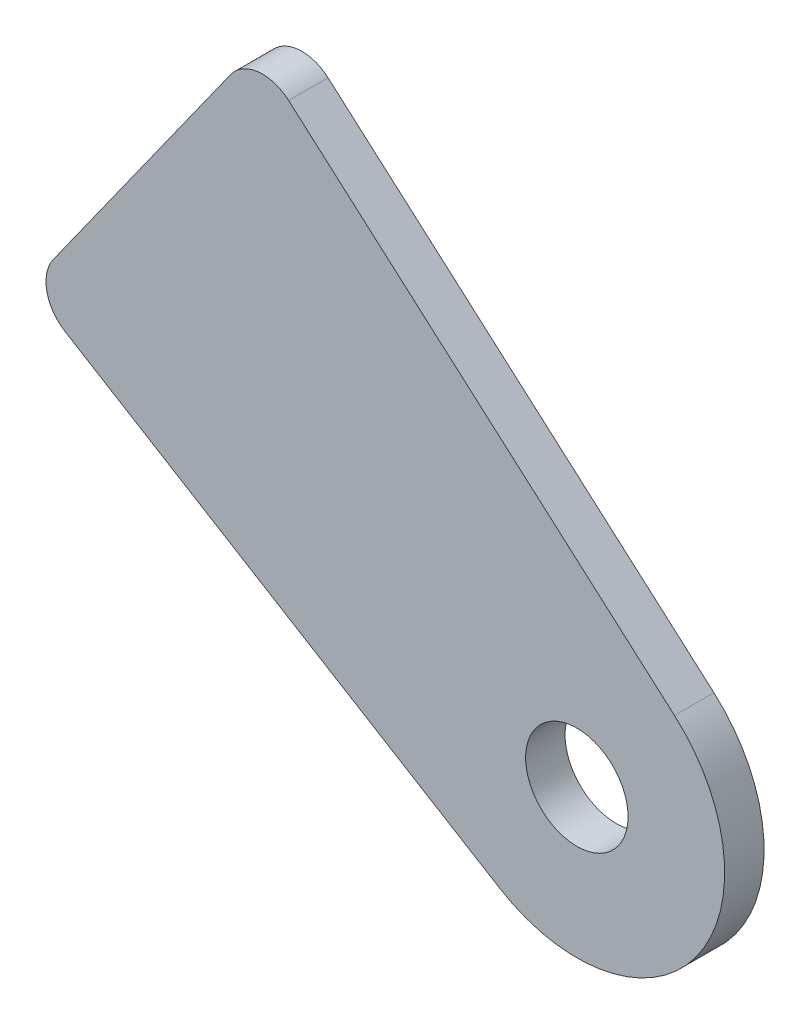
ISO-10303-21;
HEADER;
FILE_DESCRIPTION(('STEP AP214'),'2;1');
FILE_NAME('part.step','',(''),(''),'','','');
FILE_SCHEMA(('AUTOMOTIVE_DESIGN { 1 0 10303 214 1 1 1 1 }'));
ENDSEC;
DATA;
#1=APPLICATION_CONTEXT('core data for automotive mechanical design processes');
#2=APPLICATION_PROTOCOL_DEFINITION('international standard','automotive_design',2000,#1);
#3=PRODUCT_CONTEXT('',#1,'mechanical');
#4=PRODUCT('Part','Part','',(#3));
#5=PRODUCT_RELATED_PRODUCT_CATEGORY('part','',(#4));
#6=PRODUCT_DEFINITION_FORMATION('','',#4);
#7=PRODUCT_DEFINITION_CONTEXT('part definition',#1,'design');
#8=PRODUCT_DEFINITION('design','',#6,#7);
#9=PRODUCT_DEFINITION_SHAPE('','',#8);
#10=(LENGTH_UNIT() NAMED_UNIT(*) SI_UNIT(.MILLI.,.METRE.));
#11=(NAMED_UNIT(*) PLANE_ANGLE_UNIT() SI_UNIT($,.RADIAN.));
#12=(NAMED_UNIT(*) SI_UNIT($,.STERADIAN.) SOLID_ANGLE_UNIT());
#13=UNCERTAINTY_MEASURE_WITH_UNIT(LENGTH_MEASURE(1.E-05),#10,'distance_accuracy_value','');
#14=(GEOMETRIC_REPRESENTATION_CONTEXT(3) GLOBAL_UNCERTAINTY_ASSIGNED_CONTEXT((#13)) GLOBAL_UNIT_ASSIGNED_CONTEXT((#10,
#11,#12)) REPRESENTATION_CONTEXT('',''));
#15=CARTESIAN_POINT('',(0.,0.,0.));
#16=DIRECTION('',(0.,0.,1.));
#17=DIRECTION('',(1.,0.,0.));
#18=AXIS2_PLACEMENT_3D('',#15,#16,#17);
#19=CARTESIAN_POINT('',(29.2637866654175,-21.5291128535,2.54));
#20=DIRECTION('',(0.,0.,-1.));
#21=DIRECTION('',(-1.,0.,0.));
#22=AXIS2_PLACEMENT_3D('',#19,#20,#21);
#23=PLANE('',#22);
#24=DIRECTION('',(-0.750672826400325,0.660674131250912,0.));
#25=VECTOR('',#24,1.);
#26=CARTESIAN_POINT('',(35.5567077655825,-14.3789541820369,2.54));
#27=LINE('',#26,#25);
#28=CARTESIAN_POINT('',(35.5567077655825,-14.3789541820369,2.54));
#29=VERTEX_POINT('',#28);
#30=CARTESIAN_POINT('',(10.690577545839,7.50595812960176,2.54));
#31=VERTEX_POINT('',#30);
#32=EDGE_CURVE('E90',#29,#31,#27,.T.);
#33=ORIENTED_EDGE('',*,*,#32,.T.);
#34=CARTESIAN_POINT('',(9.01246525246168,5.59924915054494,2.54));
#35=DIRECTION('',(0.,0.,-1.));
#36=DIRECTION('',(-1.,0.,0.));
#37=AXIS2_PLACEMENT_3D('',#34,#35,#36);
#38=CIRCLE('',#37,2.54);
#39=CARTESIAN_POINT('',(6.94414597461786,7.07358132644683,2.54));
#40=VERTEX_POINT('',#39);
#41=EDGE_CURVE('E11',#31,#40,#38,.F.);
#42=ORIENTED_EDGE('',*,*,#41,.T.);
#43=DIRECTION('',(-0.580445738544051,-0.814298928284971,0.));
#44=VECTOR('',#43,1.);
#45=CARTESIAN_POINT('',(-6.05546921231891,-11.1633907312544,2.54));
#46=LINE('',#45,#44);
#47=CARTESIAN_POINT('',(-4.4708788368058,-8.94039182047327,2.54));
#48=VERTEX_POINT('',#47);
#49=EDGE_CURVE('E99',#40,#48,#46,.T.);
#50=ORIENTED_EDGE('',*,*,#49,.T.);
#51=CARTESIAN_POINT('',(-2.40255955896198,-10.4147239963752,2.54));
#52=DIRECTION('',(0.,0.,-1.));
#53=DIRECTION('',(-1.,0.,0.));
#54=AXIS2_PLACEMENT_3D('',#51,#52,#53);
#55=CIRCLE('',#54,2.54);
#56=CARTESIAN_POINT('',(-3.72415495287029,-12.5838218767854,2.54));
#57=VERTEX_POINT('',#56);
#58=EDGE_CURVE('E134',#48,#57,#55,.F.);
#59=ORIENTED_EDGE('',*,*,#58,.T.);
#60=DIRECTION('',(0.853975543468616,-0.520313147207989,0.));
#61=VECTOR('',#60,1.);
#62=CARTESIAN_POINT('',(24.3078039382614,-29.6632299050386,2.54));
#63=LINE('',#62,#61);
#64=CARTESIAN_POINT('',(24.3078039382614,-29.6632299050386,2.54));
#65=VERTEX_POINT('',#64);
#66=EDGE_CURVE('E105',#57,#65,#63,.T.);
#67=ORIENTED_EDGE('',*,*,#66,.T.);
#68=CARTESIAN_POINT('',(29.2637866654175,-21.5291128535,2.54));
#69=DIRECTION('',(0.,0.,1.));
#70=DIRECTION('',(-1.,0.,0.));
#71=AXIS2_PLACEMENT_3D('',#68,#69,#70);
#72=CIRCLE('',#71,9.525);
#73=EDGE_CURVE('E100',#65,#29,#72,.T.);
#74=ORIENTED_EDGE('',*,*,#73,.T.);
#75=EDGE_LOOP('',(#33,#42,#50,#59,#67,#74));
#76=FACE_BOUND('',#75,.T.);
#77=CARTESIAN_POINT('',(29.2637866654175,-21.5291128535,2.54));
#78=DIRECTION('',(0.,0.,1.));
#79=DIRECTION('',(1.,0.,0.));
#80=AXIS2_PLACEMENT_3D('',#77,#78,#79);
#81=CIRCLE('',#80,3.29999999999998);
#82=CARTESIAN_POINT('',(32.5637866654175,-21.5291128535,2.54));
#83=VERTEX_POINT('',#82);
#84=EDGE_CURVE('E162',#83,#83,#81,.T.);
#85=ORIENTED_EDGE('',*,*,#84,.F.);
#86=EDGE_LOOP('',(#85));
#87=FACE_BOUND('',#86,.T.);
#88=ADVANCED_FACE('F40',(#76,#87),#23,.F.);
#89=CARTESIAN_POINT('',(29.2637866654175,-21.5291128535,0.));
#90=DIRECTION('',(0.,0.,-1.));
#91=DIRECTION('',(-1.,0.,0.));
#92=AXIS2_PLACEMENT_3D('',#89,#90,#91);
#93=PLANE('',#92);
#94=DIRECTION('',(-0.580445738544051,-0.814298928284971,0.));
#95=VECTOR('',#94,1.);
#96=CARTESIAN_POINT('',(-6.05546921231891,-11.1633907312544,0.));
#97=LINE('',#96,#95);
#98=CARTESIAN_POINT('',(6.94414597461786,7.07358132644683,0.));
#99=VERTEX_POINT('',#98);
#100=CARTESIAN_POINT('',(-4.4708788368058,-8.94039182047327,0.));
#101=VERTEX_POINT('',#100);
#102=EDGE_CURVE('E147',#99,#101,#97,.T.);
#103=ORIENTED_EDGE('',*,*,#102,.F.);
#104=CARTESIAN_POINT('',(9.01246525246168,5.59924915054494,0.));
#105=DIRECTION('',(0.,0.,-1.));
#106=DIRECTION('',(-1.,0.,0.));
#107=AXIS2_PLACEMENT_3D('',#104,#105,#106);
#108=CIRCLE('',#107,2.54);
#109=CARTESIAN_POINT('',(10.690577545839,7.50595812960176,0.));
#110=VERTEX_POINT('',#109);
#111=EDGE_CURVE('E63',#99,#110,#108,.T.);
#112=ORIENTED_EDGE('',*,*,#111,.T.);
#113=DIRECTION('',(-0.750672826400325,0.660674131250912,0.));
#114=VECTOR('',#113,1.);
#115=CARTESIAN_POINT('',(35.5567077655825,-14.3789541820369,0.));
#116=LINE('',#115,#114);
#117=CARTESIAN_POINT('',(35.5567077655825,-14.3789541820369,0.));
#118=VERTEX_POINT('',#117);
#119=EDGE_CURVE('E154',#118,#110,#116,.T.);
#120=ORIENTED_EDGE('',*,*,#119,.F.);
#121=CARTESIAN_POINT('',(29.2637866654175,-21.5291128535,0.));
#122=DIRECTION('',(0.,0.,1.));
#123=DIRECTION('',(-1.,0.,0.));
#124=AXIS2_PLACEMENT_3D('',#121,#122,#123);
#125=CIRCLE('',#124,9.525);
#126=CARTESIAN_POINT('',(24.3078039382614,-29.6632299050386,0.));
#127=VERTEX_POINT('',#126);
#128=EDGE_CURVE('E114',#127,#118,#125,.T.);
#129=ORIENTED_EDGE('',*,*,#128,.F.);
#130=DIRECTION('',(0.853975543468616,-0.520313147207989,0.));
#131=VECTOR('',#130,1.);
#132=CARTESIAN_POINT('',(24.3078039382614,-29.6632299050386,0.));
#133=LINE('',#132,#131);
#134=CARTESIAN_POINT('',(-3.72415495287029,-12.5838218767854,0.));
#135=VERTEX_POINT('',#134);
#136=EDGE_CURVE('E110',#135,#127,#133,.T.);
#137=ORIENTED_EDGE('',*,*,#136,.F.);
#138=CARTESIAN_POINT('',(-2.40255955896198,-10.4147239963752,0.));
#139=DIRECTION('',(0.,0.,-1.));
#140=DIRECTION('',(-1.,0.,0.));
#141=AXIS2_PLACEMENT_3D('',#138,#139,#140);
#142=CIRCLE('',#141,2.54);
#143=EDGE_CURVE('E122',#135,#101,#142,.T.);
#144=ORIENTED_EDGE('',*,*,#143,.T.);
#145=EDGE_LOOP('',(#103,#112,#120,#129,#137,#144));
#146=FACE_BOUND('',#145,.T.);
#147=CARTESIAN_POINT('',(29.2637866654175,-21.5291128535,0.));
#148=DIRECTION('',(0.,0.,1.));
#149=DIRECTION('',(1.,0.,0.));
#150=AXIS2_PLACEMENT_3D('',#147,#148,#149);
#151=CIRCLE('',#150,3.29999999999998);
#152=CARTESIAN_POINT('',(32.5637866654175,-21.5291128535,0.));
#153=VERTEX_POINT('',#152);
#154=EDGE_CURVE('E167',#153,#153,#151,.T.);
#155=ORIENTED_EDGE('',*,*,#154,.T.);
#156=EDGE_LOOP('',(#155));
#157=FACE_BOUND('',#156,.T.);
#158=ADVANCED_FACE('F149',(#146,#157),#93,.T.);
#159=CARTESIAN_POINT('',(29.2637866654175,-21.5291128535,2.54));
#160=DIRECTION('',(0.,0.,-1.));
#161=DIRECTION('',(-1.,0.,0.));
#162=AXIS2_PLACEMENT_3D('',#159,#160,#161);
#163=CYLINDRICAL_SURFACE('',#162,9.525);
#164=ORIENTED_EDGE('',*,*,#128,.T.);
#165=DIRECTION('',(0.,0.,-1.));
#166=VECTOR('',#165,1.);
#167=CARTESIAN_POINT('',(35.5567077655825,-14.3789541820369,2.54));
#168=LINE('',#167,#166);
#169=EDGE_CURVE('E94',#29,#118,#168,.T.);
#170=ORIENTED_EDGE('',*,*,#169,.F.);
#171=ORIENTED_EDGE('',*,*,#73,.F.);
#172=DIRECTION('',(0.,0.,-1.));
#173=VECTOR('',#172,1.);
#174=CARTESIAN_POINT('',(24.3078039382614,-29.6632299050386,2.54));
#175=LINE('',#174,#173);
#176=EDGE_CURVE('E117',#65,#127,#175,.T.);
#177=ORIENTED_EDGE('',*,*,#176,.T.);
#178=EDGE_LOOP('',(#164,#170,#171,#177));
#179=FACE_BOUND('',#178,.T.);
#180=ADVANCED_FACE('F112',(#179),#163,.T.);
#181=CARTESIAN_POINT('',(35.5567077655825,-14.3789541820369,2.54));
#182=DIRECTION('',(-0.660674131250913,-0.750672826400325,0.));
#183=DIRECTION('',(0.750672826400325,-0.660674131250913,0.));
#184=AXIS2_PLACEMENT_3D('',#181,#182,#183);
#185=PLANE('',#184);
#186=ORIENTED_EDGE('',*,*,#119,.T.);
#187=DIRECTION('',(0.,0.,-1.));
#188=VECTOR('',#187,1.);
#189=CARTESIAN_POINT('',(10.690577545839,7.50595812960176,2.54));
#190=LINE('',#189,#188);
#191=EDGE_CURVE('E49',#110,#31,#190,.F.);
#192=ORIENTED_EDGE('',*,*,#191,.T.);
#193=ORIENTED_EDGE('',*,*,#32,.F.);
#194=ORIENTED_EDGE('',*,*,#169,.T.);
#195=EDGE_LOOP('',(#186,#192,#193,#194));
#196=FACE_BOUND('',#195,.T.);
#197=ADVANCED_FACE('F92',(#196),#185,.F.);
#198=CARTESIAN_POINT('',(-6.05546921231891,-11.1633907312544,2.54));
#199=DIRECTION('',(0.81429892828497,-0.580445738544051,0.));
#200=DIRECTION('',(0.580445738544051,0.81429892828497,0.));
#201=AXIS2_PLACEMENT_3D('',#198,#199,#200);
#202=PLANE('',#201);
#203=ORIENTED_EDGE('',*,*,#49,.F.);
#204=DIRECTION('',(0.,0.,-1.));
#205=VECTOR('',#204,1.);
#206=CARTESIAN_POINT('',(6.94414597461786,7.07358132644683,2.54));
#207=LINE('',#206,#205);
#208=EDGE_CURVE('E137',#40,#99,#207,.T.);
#209=ORIENTED_EDGE('',*,*,#208,.T.);
#210=ORIENTED_EDGE('',*,*,#102,.T.);
#211=DIRECTION('',(0.,0.,-1.));
#212=VECTOR('',#211,1.);
#213=CARTESIAN_POINT('',(-4.4708788368058,-8.94039182047327,2.54));
#214=LINE('',#213,#212);
#215=EDGE_CURVE('E130',#101,#48,#214,.F.);
#216=ORIENTED_EDGE('',*,*,#215,.T.);
#217=EDGE_LOOP('',(#203,#209,#210,#216));
#218=FACE_BOUND('',#217,.T.);
#219=ADVANCED_FACE('F146',(#218),#202,.F.);
#220=CARTESIAN_POINT('',(24.3078039382614,-29.6632299050386,2.54));
#221=DIRECTION('',(0.520313147207989,0.853975543468616,0.));
#222=DIRECTION('',(-0.853975543468616,0.520313147207989,0.));
#223=AXIS2_PLACEMENT_3D('',#220,#221,#222);
#224=PLANE('',#223);
#225=ORIENTED_EDGE('',*,*,#66,.F.);
#226=DIRECTION('',(0.,0.,-1.));
#227=VECTOR('',#226,1.);
#228=CARTESIAN_POINT('',(-3.72415495287028,-12.5838218767854,2.54));
#229=LINE('',#228,#227);
#230=EDGE_CURVE('E116',#57,#135,#229,.T.);
#231=ORIENTED_EDGE('',*,*,#230,.T.);
#232=ORIENTED_EDGE('',*,*,#136,.T.);
#233=ORIENTED_EDGE('',*,*,#176,.F.);
#234=EDGE_LOOP('',(#225,#231,#232,#233));
#235=FACE_BOUND('',#234,.T.);
#236=ADVANCED_FACE('F186',(#235),#224,.F.);
#237=CARTESIAN_POINT('',(29.2637866654175,-21.5291128535,2.54));
#238=DIRECTION('',(0.,0.,-1.));
#239=DIRECTION('',(-1.,0.,0.));
#240=AXIS2_PLACEMENT_3D('',#237,#238,#239);
#241=CYLINDRICAL_SURFACE('',#240,3.29999999999998);
#242=ORIENTED_EDGE('',*,*,#84,.T.);
#243=EDGE_LOOP('',(#242));
#244=FACE_BOUND('',#243,.T.);
#245=ORIENTED_EDGE('',*,*,#154,.F.);
#246=EDGE_LOOP('',(#245));
#247=FACE_BOUND('',#246,.T.);
#248=ADVANCED_FACE('F175',(#244,#247),#241,.F.);
#249=CARTESIAN_POINT('',(-2.40255955896198,-10.4147239963752,2.54));
#250=DIRECTION('',(0.,0.,-1.));
#251=DIRECTION('',(-1.,0.,0.));
#252=AXIS2_PLACEMENT_3D('',#249,#250,#251);
#253=CYLINDRICAL_SURFACE('',#252,2.54);
#254=ORIENTED_EDGE('',*,*,#58,.F.);
#255=ORIENTED_EDGE('',*,*,#215,.F.);
#256=ORIENTED_EDGE('',*,*,#143,.F.);
#257=ORIENTED_EDGE('',*,*,#230,.F.);
#258=EDGE_LOOP('',(#254,#255,#256,#257));
#259=FACE_BOUND('',#258,.T.);
#260=ADVANCED_FACE('F195',(#259),#253,.T.);
#261=CARTESIAN_POINT('',(9.01246525246168,5.59924915054494,2.54));
#262=DIRECTION('',(0.,0.,-1.));
#263=DIRECTION('',(-1.,0.,0.));
#264=AXIS2_PLACEMENT_3D('',#261,#262,#263);
#265=CYLINDRICAL_SURFACE('',#264,2.54);
#266=ORIENTED_EDGE('',*,*,#41,.F.);
#267=ORIENTED_EDGE('',*,*,#191,.F.);
#268=ORIENTED_EDGE('',*,*,#111,.F.);
#269=ORIENTED_EDGE('',*,*,#208,.F.);
#270=EDGE_LOOP('',(#266,#267,#268,#269));
#271=FACE_BOUND('',#270,.T.);
#272=ADVANCED_FACE('F42',(#271),#265,.T.);
#273=CLOSED_SHELL('',(#88,#158,#180,#197,#219,#236,#248,#260,#272));
#274=MANIFOLD_SOLID_BREP('B2',#273);
#275=ADVANCED_BREP_SHAPE_REPRESENTATION('',(#18,#274),#14);
#276=SHAPE_DEFINITION_REPRESENTATION(#9,#275);
ENDSEC;
END-ISO-10303-21;
